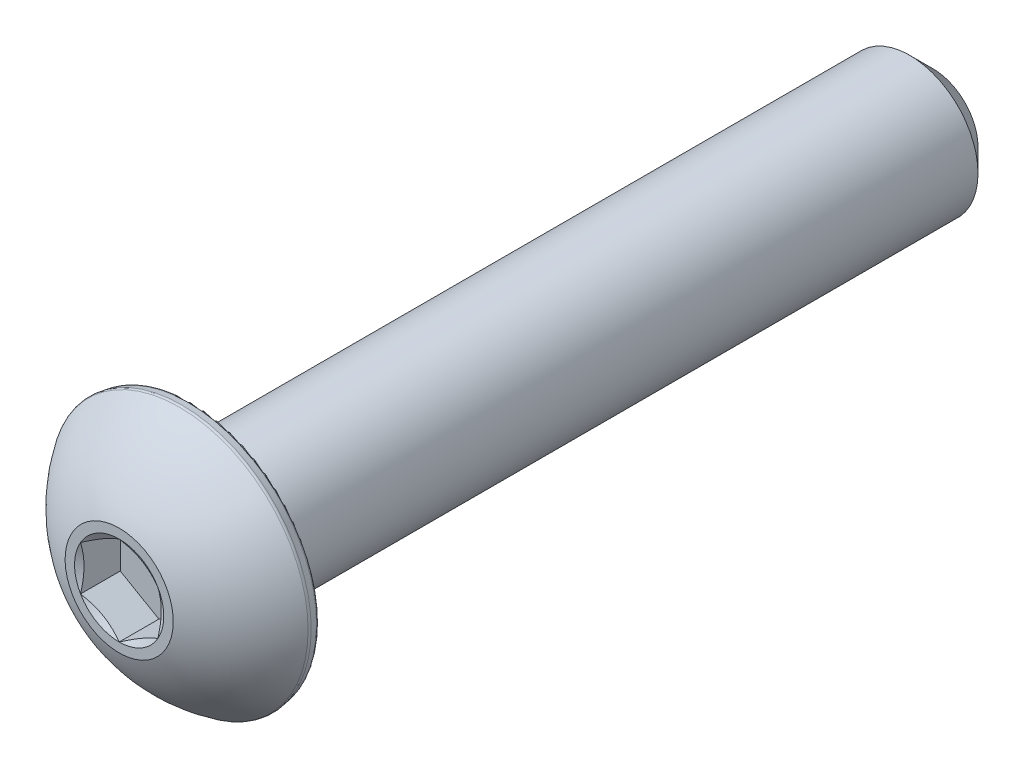
ISO-10303-21;
HEADER;
FILE_DESCRIPTION(('STEP AP214'),'2;1');
FILE_NAME('part.step','',(''),(''),'','','');
FILE_SCHEMA(('AUTOMOTIVE_DESIGN { 1 0 10303 214 1 1 1 1 }'));
ENDSEC;
DATA;
#1=APPLICATION_CONTEXT('core data for automotive mechanical design processes');
#2=APPLICATION_PROTOCOL_DEFINITION('international standard','automotive_design',2000,#1);
#3=PRODUCT_CONTEXT('',#1,'mechanical');
#4=PRODUCT('Part','Part','',(#3));
#5=PRODUCT_RELATED_PRODUCT_CATEGORY('part','',(#4));
#6=PRODUCT_DEFINITION_FORMATION('','',#4);
#7=PRODUCT_DEFINITION_CONTEXT('part definition',#1,'design');
#8=PRODUCT_DEFINITION('design','',#6,#7);
#9=PRODUCT_DEFINITION_SHAPE('','',#8);
#10=(LENGTH_UNIT() NAMED_UNIT(*) SI_UNIT(.MILLI.,.METRE.));
#11=(NAMED_UNIT(*) PLANE_ANGLE_UNIT() SI_UNIT($,.RADIAN.));
#12=(NAMED_UNIT(*) SI_UNIT($,.STERADIAN.) SOLID_ANGLE_UNIT());
#13=UNCERTAINTY_MEASURE_WITH_UNIT(LENGTH_MEASURE(1.E-05),#10,'distance_accuracy_value','');
#14=(GEOMETRIC_REPRESENTATION_CONTEXT(3) GLOBAL_UNCERTAINTY_ASSIGNED_CONTEXT((#13)) GLOBAL_UNIT_ASSIGNED_CONTEXT((#10,
#11,#12)) REPRESENTATION_CONTEXT('',''));
#15=CARTESIAN_POINT('',(0.,0.,0.));
#16=DIRECTION('',(0.,0.,1.));
#17=DIRECTION('',(1.,0.,0.));
#18=AXIS2_PLACEMENT_3D('',#15,#16,#17);
#19=CARTESIAN_POINT('',(0.,0.,10.4521));
#20=DIRECTION('',(0.,0.,-1.));
#21=DIRECTION('',(-1.,0.,0.));
#22=AXIS2_PLACEMENT_3D('',#19,#20,#21);
#23=PLANE('',#22);
#24=CARTESIAN_POINT('',(0.,0.,10.4521));
#25=DIRECTION('',(0.,0.,1.));
#26=DIRECTION('',(1.,0.,0.));
#27=AXIS2_PLACEMENT_3D('',#24,#25,#26);
#28=CIRCLE('',#27,1.14567944042316);
#29=CARTESIAN_POINT('',(-0.9921875,0.572839720211582,10.4521));
#30=VERTEX_POINT('',#29);
#31=CARTESIAN_POINT('',(-0.9921875,-0.572839720211582,10.4521));
#32=VERTEX_POINT('',#31);
#33=EDGE_CURVE('E87',#30,#32,#28,.T.);
#34=ORIENTED_EDGE('',*,*,#33,.F.);
#35=CARTESIAN_POINT('',(0.,1.14567944042316,10.4521));
#36=VERTEX_POINT('',#35);
#37=EDGE_CURVE('E96',#36,#30,#28,.T.);
#38=ORIENTED_EDGE('',*,*,#37,.F.);
#39=CARTESIAN_POINT('',(0.9921875,0.572839720211582,10.4521));
#40=VERTEX_POINT('',#39);
#41=EDGE_CURVE('E47',#40,#36,#28,.T.);
#42=ORIENTED_EDGE('',*,*,#41,.F.);
#43=CARTESIAN_POINT('',(0.9921875,-0.572839720211582,10.4521));
#44=VERTEX_POINT('',#43);
#45=EDGE_CURVE('E54',#44,#40,#28,.T.);
#46=ORIENTED_EDGE('',*,*,#45,.F.);
#47=CARTESIAN_POINT('',(0.,-1.14567944042316,10.4521));
#48=VERTEX_POINT('',#47);
#49=EDGE_CURVE('E129',#48,#44,#28,.T.);
#50=ORIENTED_EDGE('',*,*,#49,.F.);
#51=EDGE_CURVE('E97',#32,#48,#28,.T.);
#52=ORIENTED_EDGE('',*,*,#51,.F.);
#53=EDGE_LOOP('',(#34,#38,#42,#46,#50,#52));
#54=FACE_BOUND('',#53,.T.);
#55=CARTESIAN_POINT('',(0.,0.,10.4521));
#56=DIRECTION('',(0.,0.,1.));
#57=DIRECTION('',(1.,0.,0.));
#58=AXIS2_PLACEMENT_3D('',#55,#56,#57);
#59=CIRCLE('',#58,1.3890625);
#60=CARTESIAN_POINT('',(0.,1.3890625,10.4521));
#61=VERTEX_POINT('',#60);
#62=EDGE_CURVE('E108',#61,#61,#59,.T.);
#63=ORIENTED_EDGE('',*,*,#62,.T.);
#64=EDGE_LOOP('',(#63));
#65=FACE_BOUND('',#64,.T.);
#66=ADVANCED_FACE('F33',(#54,#65),#23,.F.);
#67=CARTESIAN_POINT('',(0.,0.,6.76378261054593));
#68=DIRECTION('',(0.,0.,1.));
#69=DIRECTION('',(0.,1.,0.));
#70=AXIS2_PLACEMENT_3D('',#67,#68,#69);
#71=SPHERICAL_SURFACE('',#70,3.94121552243157);
#72=CARTESIAN_POINT('',(0.,0.,8.90687798382137));
#73=DIRECTION('',(0.,0.,-1.));
#74=DIRECTION('',(-1.,0.,0.));
#75=AXIS2_PLACEMENT_3D('',#72,#73,#74);
#76=CIRCLE('',#75,3.30761575992451);
#77=CARTESIAN_POINT('',(0.,3.3076157599245,8.90687798382137));
#78=VERTEX_POINT('',#77);
#79=EDGE_CURVE('E107',#78,#78,#76,.F.);
#80=CARTESIAN_POINT('',(0.,3.3076157599245,8.90687798382137));
#81=CARTESIAN_POINT('',(0.,3.29342455417094,8.92878050909002));
#82=CARTESIAN_POINT('',(0.,3.27901573621225,8.95054203590978));
#83=CARTESIAN_POINT('',(0.,3.24976869562301,8.9937745953984));
#84=CARTESIAN_POINT('',(0.,3.23493047299246,9.01524562806726));
#85=CARTESIAN_POINT('',(0.,3.20483044279796,9.05788870200097));
#86=CARTESIAN_POINT('',(0.,3.189568635234,9.07906074326582));
#87=CARTESIAN_POINT('',(0.,3.15862746747384,9.12109748584495));
#88=CARTESIAN_POINT('',(0.,3.14294810727763,9.14196218715923));
#89=CARTESIAN_POINT('',(0.,3.11117801916502,9.18337601434444));
#90=CARTESIAN_POINT('',(0.,3.0950872912486,9.20392514021538));
#91=CARTESIAN_POINT('',(0.,3.06250081820394,9.2446997077608));
#92=CARTESIAN_POINT('',(0.,3.04600507307568,9.26492514943527));
#93=CARTESIAN_POINT('',(0.,3.01261507507252,9.3050443669779));
#94=CARTESIAN_POINT('',(0.,2.99572082219761,9.32493814284605));
#95=CARTESIAN_POINT('',(0.,2.9615404756619,9.36438617820847));
#96=CARTESIAN_POINT('',(0.,2.9442543820011,9.38394043770273));
#97=CARTESIAN_POINT('',(0.,2.90929717542219,9.42270172368935));
#98=CARTESIAN_POINT('',(0.,2.89162606250409,9.44190875018171));
#99=CARTESIAN_POINT('',(0.,2.8559057908946,9.47996799057506));
#100=CARTESIAN_POINT('',(0.,2.83785663220322,9.49882020447604));
#101=CARTESIAN_POINT('',(0.,2.80138739171335,9.53616238011238));
#102=CARTESIAN_POINT('',(0.,2.78296730991488,9.55465234184774));
#103=CARTESIAN_POINT('',(0.,2.74576349225414,9.59126271653351));
#104=CARTESIAN_POINT('',(0.,2.72697975639188,9.60938312948393));
#105=CARTESIAN_POINT('',(0.,2.68905604315389,9.64524725581384));
#106=CARTESIAN_POINT('',(0.,2.66991606577817,9.66299096919333));
#107=CARTESIAN_POINT('',(0.,2.63128742264582,9.69809469425093));
#108=CARTESIAN_POINT('',(0.,2.61179875688921,9.71545470592904));
#109=CARTESIAN_POINT('',(0.,2.57248042772913,9.74978417687202));
#110=CARTESIAN_POINT('',(0.,2.55265076432567,9.7667536361369));
#111=CARTESIAN_POINT('',(0.,2.51265826517249,9.80029530566375));
#112=CARTESIAN_POINT('',(0.,2.49249542942277,9.81686751592572));
#113=CARTESIAN_POINT('',(0.,2.45184454235613,9.84960814762183));
#114=CARTESIAN_POINT('',(0.,2.43135649103921,9.86577656905598));
#115=CARTESIAN_POINT('',(0.,2.39006325795573,9.8977032426171));
#116=CARTESIAN_POINT('',(0.,2.36925807618917,9.91346149474408));
#117=CARTESIAN_POINT('',(0.,2.32733879247191,9.944561611075));
#118=CARTESIAN_POINT('',(0.,2.3062246905212,9.95990347527894));
#119=CARTESIAN_POINT('',(0.,2.26369589860907,9.99016476146541));
#120=CARTESIAN_POINT('',(0.,2.24228120864763,10.0050841834479));
#121=CARTESIAN_POINT('',(0.,2.1991596915073,10.0344946975999));
#122=CARTESIAN_POINT('',(0.,2.1774528643284,10.0489857897693));
#123=CARTESIAN_POINT('',(0.,2.13375563883136,10.0775339257334));
#124=CARTESIAN_POINT('',(0.,2.11176524051323,10.0915909695282));
#125=CARTESIAN_POINT('',(0.,2.06750955072034,10.1192654614678));
#126=CARTESIAN_POINT('',(0.,2.0452442592456,10.1328829096128));
#127=CARTESIAN_POINT('',(0.,2.00044756960266,10.1596728364549));
#128=CARTESIAN_POINT('',(0.,1.97791617143446,10.1728453151521));
#129=CARTESIAN_POINT('',(0.,1.93259615987837,10.1987401048924));
#130=CARTESIAN_POINT('',(0.,1.90980754649048,10.2114624159355));
#131=CARTESIAN_POINT('',(0.,1.8639820974801,10.2364518498277));
#132=CARTESIAN_POINT('',(0.,1.8409452618576,10.2487189726768));
#133=CARTESIAN_POINT('',(0.,1.79463245928996,10.2727931892002));
#134=CARTESIAN_POINT('',(0.,1.77135649234482,10.2846002828744));
#135=CARTESIAN_POINT('',(0.,1.72457461251609,10.3077497818689));
#136=CARTESIAN_POINT('',(0.,1.70106869963251,10.3190921871892));
#137=CARTESIAN_POINT('',(0.,1.65383620366255,10.3413078326954));
#138=CARTESIAN_POINT('',(0.,1.63010962057616,10.3521810728814));
#139=CARTESIAN_POINT('',(0.,1.58244514847849,10.3734541001383));
#140=CARTESIAN_POINT('',(0.,1.55850725946719,10.3838538872094));
#141=CARTESIAN_POINT('',(0.,1.51042961773539,10.4041758934522));
#142=CARTESIAN_POINT('',(0.,1.48628986501487,10.414098112624));
#143=CARTESIAN_POINT('',(0.,1.43781803807698,10.4334611076524));
#144=CARTESIAN_POINT('',(0.,1.41348596385961,10.442901883509));
#145=CARTESIAN_POINT('',(0.,1.3890625,10.4521));
#146=B_SPLINE_CURVE_WITH_KNOTS('',3,(#80,#81,#82,#83,#84,#85,#86,#87,#88,#89,#90,#91,#92,#93,
#94,#95,#96,#97,#98,#99,#100,#101,#102,#103,#104,#105,#106,#107,#108,#109,#110,#111,#112,#113,
#114,#115,#116,#117,#118,#119,#120,#121,#122,#123,#124,#125,#126,#127,#128,#129,#130,#131,#132,
#133,#134,#135,#136,#137,#138,#139,#140,#141,#142,#143,#144,#145),.UNSPECIFIED.,.F.,.F.,(4,2,2,
2,2,2,2,2,2,2,2,2,2,2,2,2,2,2,2,2,2,2,2,2,2,2,2,2,2,2,2,2,4),(0.,0.0782930168067681,
0.156586033613536,0.234879050420306,0.313172067227074,0.391465084033842,0.469758100840609,
0.548051117647377,0.626344134454145,0.704637151260913,0.782930168067681,0.861223184874449,
0.939516201681217,1.01780921848798,1.09610223529475,1.17439525210152,1.25268826890829,
1.33098128571506,1.40927430252183,1.48756731932859,1.56586033613536,1.64415335294213,
1.7224463697489,1.80073938655567,1.87903240336243,1.9573254201692,2.03561843697597,
2.11391145378274,2.19220447058951,2.27049748739627,2.34879050420304,2.42708352100981,
2.50537653781658),.UNSPECIFIED.);
#147=EDGE_CURVE('BSEAM202',#78,#61,#146,.T.);
#148=ORIENTED_EDGE('',*,*,#79,.T.);
#149=ORIENTED_EDGE('',*,*,#62,.F.);
#150=ORIENTED_EDGE('',*,*,#147,.T.);
#151=ORIENTED_EDGE('',*,*,#147,.F.);
#152=EDGE_LOOP('',(#148,#150,#149,#151));
#153=FACE_BOUND('',#152,.T.);
#154=ADVANCED_FACE('F202',(#153),#71,.T.);
#155=CARTESIAN_POINT('',(0.,0.,8.5979));
#156=DIRECTION('',(0.,0.,1.));
#157=DIRECTION('',(1.,0.,0.));
#158=AXIS2_PLACEMENT_3D('',#155,#156,#157);
#159=CONICAL_SURFACE('',#158,3.27835817685556,0.174532925199431);
#160=CARTESIAN_POINT('',(0.,0.,8.84036660071663));
#161=DIRECTION('',(0.,0.,-1.));
#162=DIRECTION('',(-1.,0.,0.));
#163=AXIS2_PLACEMENT_3D('',#160,#161,#162);
#164=CIRCLE('',#163,3.32111158048256);
#165=CARTESIAN_POINT('',(-3.32111158048256,0.,8.84036660071663));
#166=VERTEX_POINT('',#165);
#167=EDGE_CURVE('E41',#166,#166,#164,.T.);
#168=ORIENTED_EDGE('',*,*,#167,.T.);
#169=EDGE_LOOP('',(#168));
#170=FACE_BOUND('',#169,.T.);
#171=CARTESIAN_POINT('',(0.,0.,8.6745110774485));
#172=DIRECTION('',(0.,0.,-1.));
#173=DIRECTION('',(-1.,0.,0.));
#174=AXIS2_PLACEMENT_3D('',#171,#172,#173);
#175=CIRCLE('',#174,3.29186677683087);
#176=CARTESIAN_POINT('',(-3.29186677683087,0.,8.6745110774485));
#177=VERTEX_POINT('',#176);
#178=EDGE_CURVE('E224',#177,#177,#175,.F.);
#179=ORIENTED_EDGE('',*,*,#178,.T.);
#180=EDGE_LOOP('',(#179));
#181=FACE_BOUND('',#180,.T.);
#182=ADVANCED_FACE('F207',(#170,#181),#159,.T.);
#183=CARTESIAN_POINT('',(0.,3.27835817685556,8.5979));
#184=DIRECTION('',(0.,0.,1.));
#185=DIRECTION('',(1.,0.,0.));
#186=AXIS2_PLACEMENT_3D('',#183,#184,#185);
#187=PLANE('',#186);
#188=CARTESIAN_POINT('',(0.,0.,8.5979));
#189=DIRECTION('',(0.,0.,1.));
#190=DIRECTION('',(1.,0.,0.));
#191=AXIS2_PLACEMENT_3D('',#188,#189,#190);
#192=CIRCLE('',#191,3.20056525004911);
#193=CARTESIAN_POINT('',(3.20056525004911,0.,8.5979));
#194=VERTEX_POINT('',#193);
#195=EDGE_CURVE('E11',#194,#194,#192,.F.);
#196=ORIENTED_EDGE('',*,*,#195,.T.);
#197=EDGE_LOOP('',(#196));
#198=FACE_BOUND('',#197,.T.);
#199=CARTESIAN_POINT('',(0.,0.,8.5979));
#200=DIRECTION('',(0.,0.,1.));
#201=DIRECTION('',(1.,0.,0.));
#202=AXIS2_PLACEMENT_3D('',#199,#200,#201);
#203=CIRCLE('',#202,1.7526);
#204=CARTESIAN_POINT('',(1.7526,0.,8.5979));
#205=VERTEX_POINT('',#204);
#206=EDGE_CURVE('E289',#205,#205,#203,.T.);
#207=ORIENTED_EDGE('',*,*,#206,.T.);
#208=EDGE_LOOP('',(#207));
#209=FACE_BOUND('',#208,.T.);
#210=ADVANCED_FACE('F230',(#198,#209),#187,.F.);
#211=CARTESIAN_POINT('',(0.,0.,10.4521));
#212=DIRECTION('',(0.,0.,1.));
#213=DIRECTION('',(1.,0.,0.));
#214=AXIS2_PLACEMENT_3D('',#211,#212,#213);
#215=CYLINDRICAL_SURFACE('',#214,1.7526);
#216=ORIENTED_EDGE('',*,*,#206,.F.);
#217=EDGE_LOOP('',(#216));
#218=FACE_BOUND('',#217,.T.);
#219=CARTESIAN_POINT('',(0.,0.,-9.8567875));
#220=DIRECTION('',(0.,0.,1.));
#221=DIRECTION('',(1.,0.,0.));
#222=AXIS2_PLACEMENT_3D('',#219,#220,#221);
#223=CIRCLE('',#222,1.7526);
#224=CARTESIAN_POINT('',(1.7526,0.,-9.8567875));
#225=VERTEX_POINT('',#224);
#226=EDGE_CURVE('E286',#225,#225,#223,.T.);
#227=ORIENTED_EDGE('',*,*,#226,.T.);
#228=EDGE_LOOP('',(#227));
#229=FACE_BOUND('',#228,.T.);
#230=ADVANCED_FACE('F236',(#218,#229),#215,.T.);
#231=CARTESIAN_POINT('',(0.,0.,-10.4521));
#232=DIRECTION('',(0.,0.,1.));
#233=DIRECTION('',(1.,0.,0.));
#234=AXIS2_PLACEMENT_3D('',#231,#232,#233);
#235=CONICAL_SURFACE('',#234,1.1572875,0.785398163397445);
#236=ORIENTED_EDGE('',*,*,#226,.F.);
#237=EDGE_LOOP('',(#236));
#238=FACE_BOUND('',#237,.T.);
#239=CARTESIAN_POINT('',(0.,0.,-10.4521));
#240=DIRECTION('',(0.,0.,1.));
#241=DIRECTION('',(1.,0.,0.));
#242=AXIS2_PLACEMENT_3D('',#239,#240,#241);
#243=CIRCLE('',#242,1.1572875);
#244=CARTESIAN_POINT('',(1.1572875,0.,-10.4521));
#245=VERTEX_POINT('',#244);
#246=EDGE_CURVE('E274',#245,#245,#243,.T.);
#247=ORIENTED_EDGE('',*,*,#246,.T.);
#248=EDGE_LOOP('',(#247));
#249=FACE_BOUND('',#248,.T.);
#250=ADVANCED_FACE('F242',(#238,#249),#235,.T.);
#251=CARTESIAN_POINT('',(0.,0.,-10.4521));
#252=DIRECTION('',(0.,0.,1.));
#253=DIRECTION('',(1.,0.,0.));
#254=AXIS2_PLACEMENT_3D('',#251,#252,#253);
#255=PLANE('',#254);
#256=ORIENTED_EDGE('',*,*,#246,.F.);
#257=EDGE_LOOP('',(#256));
#258=FACE_BOUND('',#257,.T.);
#259=ADVANCED_FACE('F246',(#258),#255,.F.);
#260=CARTESIAN_POINT('',(0.,0.,10.4521));
#261=DIRECTION('',(0.,0.,1.));
#262=DIRECTION('',(1.,0.,0.));
#263=AXIS2_PLACEMENT_3D('',#260,#261,#262);
#264=CONICAL_SURFACE('',#263,1.14567944042316,1.0471975511966);
#265=ORIENTED_EDGE('',*,*,#51,.T.);
#266=CARTESIAN_POINT('',(-0.9923875,-0.572724250157744,10.4521666767444));
#267=CARTESIAN_POINT('',(-0.948783492658108,-0.597899035534332,10.4376234442558));
#268=CARTESIAN_POINT('',(-0.904803103628137,-0.62329112497985,10.424396299182));
#269=CARTESIAN_POINT('',(-0.816080559479615,-0.674515109727188,10.4013067952555));
#270=CARTESIAN_POINT('',(-0.771336826407994,-0.700347916060637,10.3914526070224));
#271=CARTESIAN_POINT('',(-0.682403948333445,-0.751693337156786,10.3761112263757));
#272=CARTESIAN_POINT('',(-0.638228496705448,-0.777198046045783,10.3705219611989));
#273=CARTESIAN_POINT('',(-0.549669445096507,-0.828327638331383,10.363846252907));
#274=CARTESIAN_POINT('',(-0.50528616758769,-0.853952335548616,10.36275428521));
#275=CARTESIAN_POINT('',(-0.422334414499644,-0.901844552523751,10.3650107308994));
#276=CARTESIAN_POINT('',(-0.383753600489384,-0.92411919587813,10.3678051057454));
#277=CARTESIAN_POINT('',(-0.306843358672616,-0.96852334469448,10.3766663670157));
#278=CARTESIAN_POINT('',(-0.268514197423255,-0.990652696259611,10.3827362883852));
#279=CARTESIAN_POINT('',(-0.191445032493357,-1.03514859937811,10.3979124841969));
#280=CARTESIAN_POINT('',(-0.152714796666076,-1.05750951145877,10.4070831707724));
#281=CARTESIAN_POINT('',(-0.075832395941336,-1.10189758621314,10.4278977373607));
#282=CARTESIAN_POINT('',(-0.0376792439873593,-1.1239253187642,10.4395367180526));
#283=CARTESIAN_POINT('',(0.000200000000000448,-1.145794910477,10.4521666767444));
#284=B_SPLINE_CURVE_WITH_KNOTS('',3,(#266,#267,#268,#269,#270,#271,#272,#273,#274,#275,#276,
#277,#278,#279,#280,#281,#282,#283),.UNSPECIFIED.,.F.,.F.,(4,2,2,2,2,2,2,2,4),(0.,
0.157285476252498,0.314949306777112,0.468709903890828,0.622281561568945,0.756064601398106,
0.889971810762988,1.02685159539063,1.16346218837027),.UNSPECIFIED.);
#285=EDGE_CURVE('E102',#32,#48,#284,.T.);
#286=ORIENTED_EDGE('',*,*,#285,.F.);
#287=EDGE_LOOP('',(#265,#286));
#288=FACE_BOUND('',#287,.T.);
#289=ADVANCED_FACE('F103',(#288),#264,.F.);
#290=ORIENTED_EDGE('',*,*,#49,.T.);
#291=CARTESIAN_POINT('',(-0.000199999999999626,-1.145794910477,10.4521666767444));
#292=CARTESIAN_POINT('',(0.0434040073418924,-1.12062012510041,10.4376234442558));
#293=CARTESIAN_POINT('',(0.0873843963718637,-1.0952280356549,10.424396299182));
#294=CARTESIAN_POINT('',(0.176106940520386,-1.04400405090756,10.4013067952555));
#295=CARTESIAN_POINT('',(0.220850673592007,-1.01817124457411,10.3914526070224));
#296=CARTESIAN_POINT('',(0.309783551666555,-0.96682582347796,10.3761112263757));
#297=CARTESIAN_POINT('',(0.353959003294552,-0.941321114588963,10.3705219611989));
#298=CARTESIAN_POINT('',(0.442518054903493,-0.890191522303363,10.363846252907));
#299=CARTESIAN_POINT('',(0.48690133241231,-0.864566825086129,10.36275428521));
#300=CARTESIAN_POINT('',(0.569853085500356,-0.816674608110994,10.3650107308994));
#301=CARTESIAN_POINT('',(0.608433899510616,-0.794399964756616,10.3678051057454));
#302=CARTESIAN_POINT('',(0.685344141327384,-0.749995815940266,10.3766663670157));
#303=CARTESIAN_POINT('',(0.723673302576745,-0.727866464375135,10.3827362883852));
#304=CARTESIAN_POINT('',(0.800742467506642,-0.683370561256639,10.3979124841969));
#305=CARTESIAN_POINT('',(0.839472703333924,-0.66100964917598,10.4070831707724));
#306=CARTESIAN_POINT('',(0.916355104058664,-0.616621574421607,10.4278977373607));
#307=CARTESIAN_POINT('',(0.95450825601264,-0.594593841870546,10.4395367180526));
#308=CARTESIAN_POINT('',(0.9923875,-0.572724250157744,10.4521666767444));
#309=B_SPLINE_CURVE_WITH_KNOTS('',3,(#291,#292,#293,#294,#295,#296,#297,#298,#299,#300,#301,
#302,#303,#304,#305,#306,#307,#308),.UNSPECIFIED.,.F.,.F.,(4,2,2,2,2,2,2,2,4),(0.,
0.157285476252498,0.314949306777112,0.468709903890828,0.622281561568945,0.756064601398106,
0.889971810762988,1.02685159539063,1.16346218837027),.UNSPECIFIED.);
#310=EDGE_CURVE('E131',#48,#44,#309,.T.);
#311=ORIENTED_EDGE('',*,*,#310,.F.);
#312=EDGE_LOOP('',(#290,#311));
#313=FACE_BOUND('',#312,.T.);
#314=ADVANCED_FACE('F315',(#313),#264,.F.);
#315=ORIENTED_EDGE('',*,*,#45,.T.);
#316=CARTESIAN_POINT('',(0.9921875,-1.48346430017253,10.8210303255462));
#317=CARTESIAN_POINT('',(0.9921875,-1.44061781379525,10.8004719346909));
#318=CARTESIAN_POINT('',(0.9921875,-1.39766756759392,10.7801307530292));
#319=CARTESIAN_POINT('',(0.9921875,-1.31150268631536,10.7399965316903));
#320=CARTESIAN_POINT('',(0.9921875,-1.26828800534353,10.7202035906601));
#321=CARTESIAN_POINT('',(0.9921875,-1.1376654035593,10.6615955832954));
#322=CARTESIAN_POINT('',(0.9921875,-1.04979116923791,10.6238005536465));
#323=CARTESIAN_POINT('',(0.9921875,-0.869982745280392,10.5515626502056));
#324=CARTESIAN_POINT('',(0.9921875,-0.778002448480644,10.5172329823099));
#325=CARTESIAN_POINT('',(0.9921875,-0.591672904739913,10.4561416497979));
#326=CARTESIAN_POINT('',(0.9921875,-0.497330517205339,10.4293603373075));
#327=CARTESIAN_POINT('',(0.9921875,-0.353913267808739,10.3982993968317));
#328=CARTESIAN_POINT('',(0.9921875,-0.305836005647331,10.3894682618397));
#329=CARTESIAN_POINT('',(0.9921875,-0.209142082644047,10.3754460065089));
#330=CARTESIAN_POINT('',(0.9921875,-0.160525458478952,10.3702546401874));
#331=CARTESIAN_POINT('',(0.9921875,-0.0636052204906785,10.3639927389429));
#332=CARTESIAN_POINT('',(0.9921875,-0.0153048356116277,10.3628735752845));
#333=CARTESIAN_POINT('',(0.9921875,0.0812158614306205,10.3647210019121));
#334=CARTESIAN_POINT('',(0.9921875,0.129436168450579,10.3676878451899));
#335=CARTESIAN_POINT('',(0.9921875,0.248413577179174,10.3797877098392));
#336=CARTESIAN_POINT('',(0.9921875,0.318940575965639,10.3911881815971));
#337=CARTESIAN_POINT('',(0.9921875,0.45861787406522,10.4205884399035));
#338=CARTESIAN_POINT('',(0.9921875,0.527766407778374,10.4385961802141));
#339=CARTESIAN_POINT('',(0.9921875,0.666170294342292,10.4797519904533));
#340=CARTESIAN_POINT('',(0.9921875,0.735393231472071,10.5030063310331));
#341=CARTESIAN_POINT('',(0.9921875,0.872567707496048,10.5528710156708));
#342=CARTESIAN_POINT('',(0.9921875,0.940519683120737,10.5794801816697));
#343=CARTESIAN_POINT('',(0.9921875,1.11337840938734,10.6505909981127));
#344=CARTESIAN_POINT('',(0.9921875,1.21759837035789,10.6967459672636));
#345=CARTESIAN_POINT('',(0.9921875,1.42454284522826,10.7922982135949));
#346=CARTESIAN_POINT('',(0.9921875,1.52726696720339,10.8416963224776));
#347=CARTESIAN_POINT('',(0.9921875,1.73183062579128,10.9425744728442));
#348=CARTESIAN_POINT('',(0.9921875,1.83366900986382,10.9940568421931));
#349=CARTESIAN_POINT('',(0.9921875,2.0366639470767,11.0983498345964));
#350=CARTESIAN_POINT('',(0.9921875,2.13782047756437,11.1511605015066));
#351=CARTESIAN_POINT('',(0.9921875,2.33011825888518,11.2526633301697));
#352=CARTESIAN_POINT('',(0.9921875,2.42130297685987,11.3012733205809));
#353=CARTESIAN_POINT('',(0.9921875,2.60337907954477,11.3990469318781));
#354=CARTESIAN_POINT('',(0.9921875,2.69427045323815,11.4482105732526));
#355=CARTESIAN_POINT('',(0.9921875,2.87559632366782,11.5468272944081));
#356=CARTESIAN_POINT('',(0.9921875,2.96603139445848,11.5962793199225));
#357=CARTESIAN_POINT('',(0.9921875,3.1467186987446,11.6955052302388));
#358=CARTESIAN_POINT('',(0.9921875,3.23697094156077,11.7452790980616));
#359=CARTESIAN_POINT('',(0.9921875,3.32715749601776,11.7951709579188));
#360=B_SPLINE_CURVE_WITH_KNOTS('',3,(#316,#317,#318,#319,#320,#321,#322,#323,#324,#325,#326,
#327,#328,#329,#330,#331,#332,#333,#334,#335,#336,#337,#338,#339,#340,#341,#342,#343,#344,#345,
#346,#347,#348,#349,#350,#351,#352,#353,#354,#355,#356,#357,#358,#359),.UNSPECIFIED.,.F.,.F.,(4,
2,2,2,2,2,2,2,2,2,2,2,2,2,2,2,2,2,2,2,2,4),(0.,0.142567761042778,0.285161010315822,
0.572055955347284,0.866437149211683,1.16004485851572,1.30657539309775,1.45309602389933,
1.59786110868255,1.74263515723342,1.95651966660498,2.17066249724049,2.38961017481526,
2.60848118115061,2.95031964853992,3.29224612535337,3.63456563896214,3.97689646967438,
4.28689119497034,4.59689742999247,4.90611515197381,5.21531669175159),.UNSPECIFIED.);
#361=EDGE_CURVE('E140',#44,#40,#360,.T.);
#362=ORIENTED_EDGE('',*,*,#361,.F.);
#363=EDGE_LOOP('',(#315,#362));
#364=FACE_BOUND('',#363,.T.);
#365=ADVANCED_FACE('F311',(#364),#264,.F.);
#366=ORIENTED_EDGE('',*,*,#41,.T.);
#367=CARTESIAN_POINT('',(0.9923875,0.572724250157745,10.4521666767444));
#368=CARTESIAN_POINT('',(0.948783492658108,0.597899035534332,10.4376234442558));
#369=CARTESIAN_POINT('',(0.904803103628137,0.623291124979851,10.424396299182));
#370=CARTESIAN_POINT('',(0.816080559479615,0.674515109727188,10.4013067952555));
#371=CARTESIAN_POINT('',(0.771336826407994,0.700347916060637,10.3914526070224));
#372=CARTESIAN_POINT('',(0.682403948333445,0.751693337156786,10.3761112263757));
#373=CARTESIAN_POINT('',(0.638228496705448,0.777198046045783,10.3705219611989));
#374=CARTESIAN_POINT('',(0.549669445096507,0.828327638331383,10.363846252907));
#375=CARTESIAN_POINT('',(0.505286167587691,0.853952335548616,10.36275428521));
#376=CARTESIAN_POINT('',(0.422334414499644,0.901844552523751,10.3650107308994));
#377=CARTESIAN_POINT('',(0.383753600489384,0.92411919587813,10.3678051057454));
#378=CARTESIAN_POINT('',(0.306843358672616,0.96852334469448,10.3766663670157));
#379=CARTESIAN_POINT('',(0.268514197423255,0.990652696259611,10.3827362883852));
#380=CARTESIAN_POINT('',(0.191445032493357,1.03514859937811,10.3979124841969));
#381=CARTESIAN_POINT('',(0.152714796666076,1.05750951145877,10.4070831707724));
#382=CARTESIAN_POINT('',(0.0758323959413361,1.10189758621314,10.4278977373607));
#383=CARTESIAN_POINT('',(0.0376792439873593,1.1239253187642,10.4395367180526));
#384=CARTESIAN_POINT('',(-0.000200000000000461,1.145794910477,10.4521666767444));
#385=B_SPLINE_CURVE_WITH_KNOTS('',3,(#367,#368,#369,#370,#371,#372,#373,#374,#375,#376,#377,
#378,#379,#380,#381,#382,#383,#384),.UNSPECIFIED.,.F.,.F.,(4,2,2,2,2,2,2,2,4),(0.,
0.157285476252498,0.314949306777112,0.468709903890829,0.622281561568945,0.756064601398106,
0.889971810762988,1.02685159539063,1.16346218837027),.UNSPECIFIED.);
#386=EDGE_CURVE('E167',#40,#36,#385,.T.);
#387=ORIENTED_EDGE('',*,*,#386,.F.);
#388=EDGE_LOOP('',(#366,#387));
#389=FACE_BOUND('',#388,.T.);
#390=ADVANCED_FACE('F307',(#389),#264,.F.);
#391=ORIENTED_EDGE('',*,*,#37,.T.);
#392=CARTESIAN_POINT('',(0.000199999999999766,1.145794910477,10.4521666767444));
#393=CARTESIAN_POINT('',(-0.0434040073418922,1.12062012510041,10.4376234442558));
#394=CARTESIAN_POINT('',(-0.0873843963718635,1.0952280356549,10.424396299182));
#395=CARTESIAN_POINT('',(-0.176106940520385,1.04400405090756,10.4013067952555));
#396=CARTESIAN_POINT('',(-0.220850673592006,1.01817124457411,10.3914526070224));
#397=CARTESIAN_POINT('',(-0.309783551666555,0.96682582347796,10.3761112263757));
#398=CARTESIAN_POINT('',(-0.353959003294552,0.941321114588963,10.3705219611989));
#399=CARTESIAN_POINT('',(-0.442518054903493,0.890191522303363,10.363846252907));
#400=CARTESIAN_POINT('',(-0.486901332412309,0.864566825086129,10.36275428521));
#401=CARTESIAN_POINT('',(-0.569853085500356,0.816674608110994,10.3650107308994));
#402=CARTESIAN_POINT('',(-0.608433899510616,0.794399964756616,10.3678051057454));
#403=CARTESIAN_POINT('',(-0.685344141327383,0.749995815940266,10.3766663670157));
#404=CARTESIAN_POINT('',(-0.723673302576744,0.727866464375135,10.3827362883852));
#405=CARTESIAN_POINT('',(-0.800742467506642,0.683370561256639,10.3979124841969));
#406=CARTESIAN_POINT('',(-0.839472703333923,0.66100964917598,10.4070831707724));
#407=CARTESIAN_POINT('',(-0.916355104058664,0.616621574421607,10.4278977373607));
#408=CARTESIAN_POINT('',(-0.95450825601264,0.594593841870546,10.4395367180526));
#409=CARTESIAN_POINT('',(-0.9923875,0.572724250157744,10.4521666767444));
#410=B_SPLINE_CURVE_WITH_KNOTS('',3,(#392,#393,#394,#395,#396,#397,#398,#399,#400,#401,#402,
#403,#404,#405,#406,#407,#408,#409),.UNSPECIFIED.,.F.,.F.,(4,2,2,2,2,2,2,2,4),(0.,
0.157285476252498,0.314949306777112,0.468709903890828,0.622281561568945,0.756064601398105,
0.889971810762988,1.02685159539063,1.16346218837027),.UNSPECIFIED.);
#411=EDGE_CURVE('E118',#36,#30,#410,.T.);
#412=ORIENTED_EDGE('',*,*,#411,.F.);
#413=EDGE_LOOP('',(#391,#412));
#414=FACE_BOUND('',#413,.T.);
#415=ADVANCED_FACE('F154',(#414),#264,.F.);
#416=ORIENTED_EDGE('',*,*,#33,.T.);
#417=CARTESIAN_POINT('',(-0.9921875,-1.48346430017253,10.8210303255462));
#418=CARTESIAN_POINT('',(-0.9921875,-1.44061781379525,10.8004719346909));
#419=CARTESIAN_POINT('',(-0.9921875,-1.39766756759392,10.7801307530292));
#420=CARTESIAN_POINT('',(-0.9921875,-1.31150268631536,10.7399965316903));
#421=CARTESIAN_POINT('',(-0.9921875,-1.26828800534353,10.7202035906601));
#422=CARTESIAN_POINT('',(-0.9921875,-1.1376654035593,10.6615955832954));
#423=CARTESIAN_POINT('',(-0.9921875,-1.04979116923792,10.6238005536465));
#424=CARTESIAN_POINT('',(-0.9921875,-0.869982745280392,10.5515626502056));
#425=CARTESIAN_POINT('',(-0.9921875,-0.778002448480645,10.5172329823099));
#426=CARTESIAN_POINT('',(-0.9921875,-0.591672904739914,10.4561416497979));
#427=CARTESIAN_POINT('',(-0.9921875,-0.497330517205339,10.4293603373075));
#428=CARTESIAN_POINT('',(-0.9921875,-0.35391326780874,10.3982993968317));
#429=CARTESIAN_POINT('',(-0.9921875,-0.305836005647332,10.3894682618397));
#430=CARTESIAN_POINT('',(-0.9921875,-0.209142082644048,10.3754460065089));
#431=CARTESIAN_POINT('',(-0.9921875,-0.160525458478952,10.3702546401874));
#432=CARTESIAN_POINT('',(-0.9921875,-0.063605220490679,10.3639927389429));
#433=CARTESIAN_POINT('',(-0.9921875,-0.0153048356116281,10.3628735752845));
#434=CARTESIAN_POINT('',(-0.9921875,0.0812158614306201,10.3647210019121));
#435=CARTESIAN_POINT('',(-0.9921875,0.129436168450578,10.3676878451899));
#436=CARTESIAN_POINT('',(-0.9921875,0.248413577179174,10.3797877098392));
#437=CARTESIAN_POINT('',(-0.9921875,0.318940575965639,10.3911881815971));
#438=CARTESIAN_POINT('',(-0.9921875,0.45861787406522,10.4205884399035));
#439=CARTESIAN_POINT('',(-0.9921875,0.527766407778373,10.4385961802141));
#440=CARTESIAN_POINT('',(-0.9921875,0.666170294342292,10.4797519904533));
#441=CARTESIAN_POINT('',(-0.9921875,0.735393231472072,10.5030063310331));
#442=CARTESIAN_POINT('',(-0.9921875,0.872567707496049,10.5528710156708));
#443=CARTESIAN_POINT('',(-0.9921875,0.940519683120738,10.5794801816697));
#444=CARTESIAN_POINT('',(-0.9921875,1.11337840938734,10.6505909981127));
#445=CARTESIAN_POINT('',(-0.9921875,1.21759837035789,10.6967459672636));
#446=CARTESIAN_POINT('',(-0.9921875,1.42454284522826,10.7922982135949));
#447=CARTESIAN_POINT('',(-0.9921875,1.52726696720339,10.8416963224776));
#448=CARTESIAN_POINT('',(-0.9921875,1.73183062579127,10.9425744728442));
#449=CARTESIAN_POINT('',(-0.9921875,1.83366900986382,10.9940568421931));
#450=CARTESIAN_POINT('',(-0.9921875,2.0366639470767,11.0983498345964));
#451=CARTESIAN_POINT('',(-0.9921875,2.13782047756437,11.1511605015066));
#452=CARTESIAN_POINT('',(-0.9921875,2.33011825888518,11.2526633301697));
#453=CARTESIAN_POINT('',(-0.992187500000001,2.42130297685988,11.3012733205809));
#454=CARTESIAN_POINT('',(-0.992187500000001,2.60337907954477,11.3990469318781));
#455=CARTESIAN_POINT('',(-0.992187500000001,2.69427045323816,11.4482105732526));
#456=CARTESIAN_POINT('',(-0.992187500000001,2.87559632366782,11.5468272944081));
#457=CARTESIAN_POINT('',(-0.992187500000001,2.96603139445848,11.5962793199225));
#458=CARTESIAN_POINT('',(-0.992187500000001,3.1467186987446,11.6955052302388));
#459=CARTESIAN_POINT('',(-0.992187500000001,3.23697094156077,11.7452790980616));
#460=CARTESIAN_POINT('',(-0.992187500000001,3.32715749601776,11.7951709579188));
#461=B_SPLINE_CURVE_WITH_KNOTS('',3,(#417,#418,#419,#420,#421,#422,#423,#424,#425,#426,#427,
#428,#429,#430,#431,#432,#433,#434,#435,#436,#437,#438,#439,#440,#441,#442,#443,#444,#445,#446,
#447,#448,#449,#450,#451,#452,#453,#454,#455,#456,#457,#458,#459,#460),.UNSPECIFIED.,.F.,.F.,(4,
2,2,2,2,2,2,2,2,2,2,2,2,2,2,2,2,2,2,2,2,4),(0.,0.142567761042778,0.285161010315823,
0.572055955347284,0.866437149211683,1.16004485851572,1.30657539309775,1.45309602389933,
1.59786110868255,1.74263515723342,1.95651966660498,2.17066249724049,2.38961017481526,
2.60848118115062,2.95031964853993,3.29224612535337,3.63456563896214,3.97689646967438,
4.28689119497034,4.59689742999248,4.90611515197381,5.21531669175159),.UNSPECIFIED.);
#462=EDGE_CURVE('E91',#30,#32,#461,.F.);
#463=ORIENTED_EDGE('',*,*,#462,.F.);
#464=EDGE_LOOP('',(#416,#463));
#465=FACE_BOUND('',#464,.T.);
#466=ADVANCED_FACE('F89',(#465),#264,.F.);
#467=CARTESIAN_POINT('',(0.,0.,9.43229));
#468=DIRECTION('',(0.,0.,1.));
#469=DIRECTION('',(1.,0.,0.));
#470=AXIS2_PLACEMENT_3D('',#467,#468,#469);
#471=PLANE('',#470);
#472=DIRECTION('',(0.,-1.,0.));
#473=VECTOR('',#472,1.);
#474=CARTESIAN_POINT('',(-0.9921875,0.572839720211582,9.43229));
#475=LINE('',#474,#473);
#476=CARTESIAN_POINT('',(-0.9921875,0.572839720211582,9.43229));
#477=VERTEX_POINT('',#476);
#478=CARTESIAN_POINT('',(-0.9921875,-0.572839720211582,9.43229));
#479=VERTEX_POINT('',#478);
#480=EDGE_CURVE('E117',#477,#479,#475,.T.);
#481=ORIENTED_EDGE('',*,*,#480,.T.);
#482=DIRECTION('',(0.866025403784439,-0.5,0.));
#483=VECTOR('',#482,1.);
#484=CARTESIAN_POINT('',(-0.9921875,-0.572839720211582,9.43229));
#485=LINE('',#484,#483);
#486=CARTESIAN_POINT('',(0.,-1.14567944042316,9.43229));
#487=VERTEX_POINT('',#486);
#488=EDGE_CURVE('E122',#479,#487,#485,.T.);
#489=ORIENTED_EDGE('',*,*,#488,.T.);
#490=DIRECTION('',(0.866025403784438,0.5,0.));
#491=VECTOR('',#490,1.);
#492=CARTESIAN_POINT('',(0.,-1.14567944042316,9.43229));
#493=LINE('',#492,#491);
#494=CARTESIAN_POINT('',(0.9921875,-0.572839720211582,9.43229));
#495=VERTEX_POINT('',#494);
#496=EDGE_CURVE('E263',#487,#495,#493,.T.);
#497=ORIENTED_EDGE('',*,*,#496,.T.);
#498=DIRECTION('',(0.,1.,0.));
#499=VECTOR('',#498,1.);
#500=CARTESIAN_POINT('',(0.9921875,-0.572839720211582,9.43229));
#501=LINE('',#500,#499);
#502=CARTESIAN_POINT('',(0.9921875,0.572839720211582,9.43229));
#503=VERTEX_POINT('',#502);
#504=EDGE_CURVE('E267',#495,#503,#501,.T.);
#505=ORIENTED_EDGE('',*,*,#504,.T.);
#506=DIRECTION('',(-0.866025403784439,0.5,0.));
#507=VECTOR('',#506,1.);
#508=CARTESIAN_POINT('',(0.9921875,0.572839720211582,9.43229));
#509=LINE('',#508,#507);
#510=CARTESIAN_POINT('',(0.,1.14567944042316,9.43229));
#511=VERTEX_POINT('',#510);
#512=EDGE_CURVE('E270',#503,#511,#509,.T.);
#513=ORIENTED_EDGE('',*,*,#512,.T.);
#514=DIRECTION('',(-0.866025403784439,-0.5,0.));
#515=VECTOR('',#514,1.);
#516=CARTESIAN_POINT('',(0.,1.14567944042316,9.43229));
#517=LINE('',#516,#515);
#518=EDGE_CURVE('E125',#511,#477,#517,.T.);
#519=ORIENTED_EDGE('',*,*,#518,.T.);
#520=EDGE_LOOP('',(#481,#489,#497,#505,#513,#519));
#521=FACE_BOUND('',#520,.T.);
#522=ADVANCED_FACE('F153',(#521),#471,.T.);
#523=CARTESIAN_POINT('',(-0.9921875,-0.572839720211582,9.43229));
#524=DIRECTION('',(-0.5,-0.866025403784439,0.));
#525=DIRECTION('',(0.866025403784439,-0.5,0.));
#526=AXIS2_PLACEMENT_3D('',#523,#524,#525);
#527=PLANE('',#526);
#528=DIRECTION('',(0.,0.,1.));
#529=VECTOR('',#528,1.);
#530=CARTESIAN_POINT('',(-0.9921875,-0.572839720211582,9.43229));
#531=LINE('',#530,#529);
#532=EDGE_CURVE('E113',#479,#32,#531,.T.);
#533=ORIENTED_EDGE('',*,*,#532,.T.);
#534=ORIENTED_EDGE('',*,*,#285,.T.);
#535=DIRECTION('',(0.,0.,1.));
#536=VECTOR('',#535,1.);
#537=CARTESIAN_POINT('',(0.,-1.14567944042316,9.43229));
#538=LINE('',#537,#536);
#539=EDGE_CURVE('E124',#487,#48,#538,.T.);
#540=ORIENTED_EDGE('',*,*,#539,.F.);
#541=ORIENTED_EDGE('',*,*,#488,.F.);
#542=EDGE_LOOP('',(#533,#534,#540,#541));
#543=FACE_BOUND('',#542,.T.);
#544=ADVANCED_FACE('F120',(#543),#527,.F.);
#545=CARTESIAN_POINT('',(0.,-1.14567944042316,9.43229));
#546=DIRECTION('',(0.5,-0.866025403784439,0.));
#547=DIRECTION('',(0.866025403784439,0.5,0.));
#548=AXIS2_PLACEMENT_3D('',#545,#546,#547);
#549=PLANE('',#548);
#550=ORIENTED_EDGE('',*,*,#539,.T.);
#551=ORIENTED_EDGE('',*,*,#310,.T.);
#552=DIRECTION('',(0.,0.,1.));
#553=VECTOR('',#552,1.);
#554=CARTESIAN_POINT('',(0.9921875,-0.572839720211582,9.43229));
#555=LINE('',#554,#553);
#556=EDGE_CURVE('E281',#495,#44,#555,.T.);
#557=ORIENTED_EDGE('',*,*,#556,.F.);
#558=ORIENTED_EDGE('',*,*,#496,.F.);
#559=EDGE_LOOP('',(#550,#551,#557,#558));
#560=FACE_BOUND('',#559,.T.);
#561=ADVANCED_FACE('F147',(#560),#549,.F.);
#562=CARTESIAN_POINT('',(0.9921875,-0.572839720211582,9.43229));
#563=DIRECTION('',(1.,0.,0.));
#564=DIRECTION('',(0.,0.,-1.));
#565=AXIS2_PLACEMENT_3D('',#562,#563,#564);
#566=PLANE('',#565);
#567=ORIENTED_EDGE('',*,*,#556,.T.);
#568=ORIENTED_EDGE('',*,*,#361,.T.);
#569=DIRECTION('',(0.,0.,1.));
#570=VECTOR('',#569,1.);
#571=CARTESIAN_POINT('',(0.9921875,0.572839720211582,9.43229));
#572=LINE('',#571,#570);
#573=EDGE_CURVE('E278',#503,#40,#572,.T.);
#574=ORIENTED_EDGE('',*,*,#573,.F.);
#575=ORIENTED_EDGE('',*,*,#504,.F.);
#576=EDGE_LOOP('',(#567,#568,#574,#575));
#577=FACE_BOUND('',#576,.T.);
#578=ADVANCED_FACE('F191',(#577),#566,.F.);
#579=CARTESIAN_POINT('',(0.9921875,0.572839720211582,9.43229));
#580=DIRECTION('',(0.5,0.866025403784439,0.));
#581=DIRECTION('',(-0.866025403784439,0.5,0.));
#582=AXIS2_PLACEMENT_3D('',#579,#580,#581);
#583=PLANE('',#582);
#584=ORIENTED_EDGE('',*,*,#573,.T.);
#585=ORIENTED_EDGE('',*,*,#386,.T.);
#586=DIRECTION('',(0.,0.,1.));
#587=VECTOR('',#586,1.);
#588=CARTESIAN_POINT('',(0.,1.14567944042316,9.43229));
#589=LINE('',#588,#587);
#590=EDGE_CURVE('E275',#511,#36,#589,.T.);
#591=ORIENTED_EDGE('',*,*,#590,.F.);
#592=ORIENTED_EDGE('',*,*,#512,.F.);
#593=EDGE_LOOP('',(#584,#585,#591,#592));
#594=FACE_BOUND('',#593,.T.);
#595=ADVANCED_FACE('F187',(#594),#583,.F.);
#596=CARTESIAN_POINT('',(0.,1.14567944042316,9.43229));
#597=DIRECTION('',(-0.5,0.866025403784438,0.));
#598=DIRECTION('',(-0.866025403784439,-0.5,0.));
#599=AXIS2_PLACEMENT_3D('',#596,#597,#598);
#600=PLANE('',#599);
#601=ORIENTED_EDGE('',*,*,#590,.T.);
#602=ORIENTED_EDGE('',*,*,#411,.T.);
#603=DIRECTION('',(0.,0.,1.));
#604=VECTOR('',#603,1.);
#605=CARTESIAN_POINT('',(-0.9921875,0.572839720211582,9.43229));
#606=LINE('',#605,#604);
#607=EDGE_CURVE('E115',#477,#30,#606,.T.);
#608=ORIENTED_EDGE('',*,*,#607,.F.);
#609=ORIENTED_EDGE('',*,*,#518,.F.);
#610=EDGE_LOOP('',(#601,#602,#608,#609));
#611=FACE_BOUND('',#610,.T.);
#612=ADVANCED_FACE('F184',(#611),#600,.F.);
#613=CARTESIAN_POINT('',(-0.9921875,0.572839720211582,9.43229));
#614=DIRECTION('',(-1.,0.,0.));
#615=DIRECTION('',(0.,-1.,0.));
#616=AXIS2_PLACEMENT_3D('',#613,#614,#615);
#617=PLANE('',#616);
#618=ORIENTED_EDGE('',*,*,#607,.T.);
#619=ORIENTED_EDGE('',*,*,#462,.T.);
#620=ORIENTED_EDGE('',*,*,#532,.F.);
#621=ORIENTED_EDGE('',*,*,#480,.F.);
#622=EDGE_LOOP('',(#618,#619,#620,#621));
#623=FACE_BOUND('',#622,.T.);
#624=ADVANCED_FACE('F111',(#623),#617,.F.);
#625=CARTESIAN_POINT('',(0.,0.,8.85646552326813));
#626=DIRECTION('',(0.,0.,-1.));
#627=DIRECTION('',(-1.,0.,0.));
#628=AXIS2_PLACEMENT_3D('',#625,#626,#627);
#629=TOROIDAL_SURFACE('',#628,3.2298100537008,0.09271);
#630=ORIENTED_EDGE('',*,*,#167,.F.);
#631=EDGE_LOOP('',(#630));
#632=FACE_BOUND('',#631,.T.);
#633=ORIENTED_EDGE('',*,*,#79,.F.);
#634=EDGE_LOOP('',(#633));
#635=FACE_BOUND('',#634,.T.);
#636=ADVANCED_FACE('F211',(#632,#635),#629,.T.);
#637=CARTESIAN_POINT('',(0.,0.,8.69061));
#638=DIRECTION('',(0.,0.,1.));
#639=DIRECTION('',(1.,0.,0.));
#640=AXIS2_PLACEMENT_3D('',#637,#638,#639);
#641=TOROIDAL_SURFACE('',#640,3.20056525004911,0.09271);
#642=ORIENTED_EDGE('',*,*,#195,.F.);
#643=EDGE_LOOP('',(#642));
#644=FACE_BOUND('',#643,.T.);
#645=ORIENTED_EDGE('',*,*,#178,.F.);
#646=EDGE_LOOP('',(#645));
#647=FACE_BOUND('',#646,.T.);
#648=ADVANCED_FACE('F35',(#644,#647),#641,.T.);
#649=CLOSED_SHELL('',(#66,#154,#182,#210,#230,#250,#259,#289,#314,#365,#390,#415,#466,#522,#544,
#561,#578,#595,#612,#624,#636,#648));
#650=MANIFOLD_SOLID_BREP('B2',#649);
#651=ADVANCED_BREP_SHAPE_REPRESENTATION('',(#18,#650),#14);
#652=SHAPE_DEFINITION_REPRESENTATION(#9,#651);
ENDSEC;
END-ISO-10303-21;
